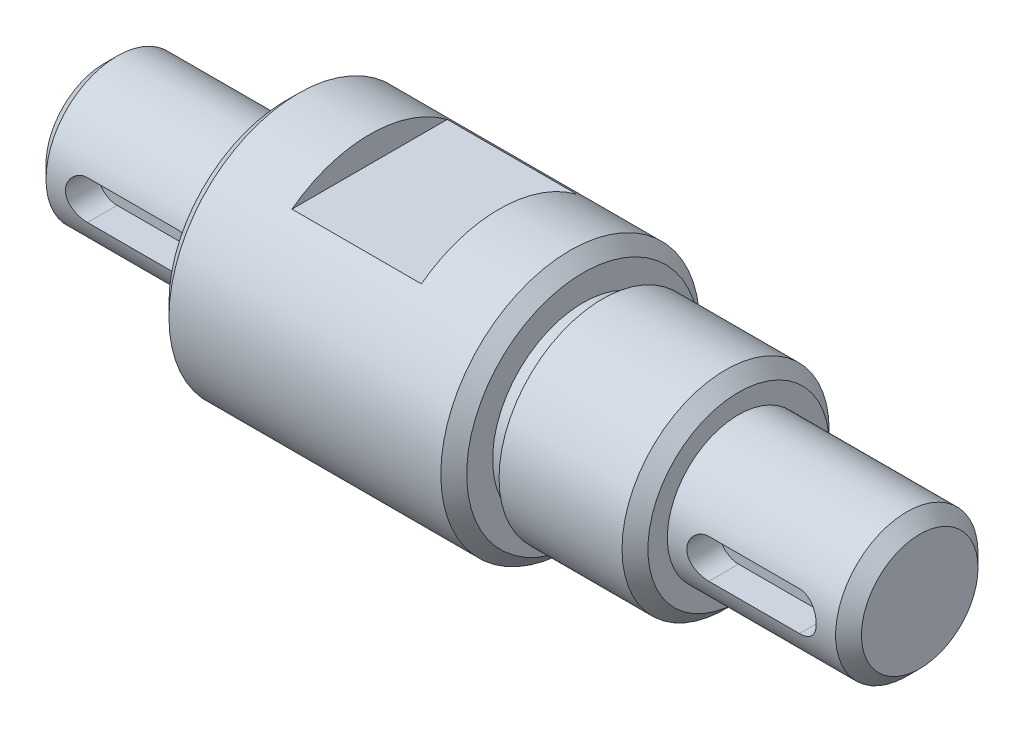
ISO-10303-21;
HEADER;
FILE_DESCRIPTION(('STEP AP214'),'2;1');
FILE_NAME('part.step','',(''),(''),'','','');
FILE_SCHEMA(('AUTOMOTIVE_DESIGN { 1 0 10303 214 1 1 1 1 }'));
ENDSEC;
DATA;
#1=APPLICATION_CONTEXT('core data for automotive mechanical design processes');
#2=APPLICATION_PROTOCOL_DEFINITION('international standard','automotive_design',2000,#1);
#3=PRODUCT_CONTEXT('',#1,'mechanical');
#4=PRODUCT('Part','Part','',(#3));
#5=PRODUCT_RELATED_PRODUCT_CATEGORY('part','',(#4));
#6=PRODUCT_DEFINITION_FORMATION('','',#4);
#7=PRODUCT_DEFINITION_CONTEXT('part definition',#1,'design');
#8=PRODUCT_DEFINITION('design','',#6,#7);
#9=PRODUCT_DEFINITION_SHAPE('','',#8);
#10=(LENGTH_UNIT() NAMED_UNIT(*) SI_UNIT(.MILLI.,.METRE.));
#11=(NAMED_UNIT(*) PLANE_ANGLE_UNIT() SI_UNIT($,.RADIAN.));
#12=(NAMED_UNIT(*) SI_UNIT($,.STERADIAN.) SOLID_ANGLE_UNIT());
#13=UNCERTAINTY_MEASURE_WITH_UNIT(LENGTH_MEASURE(1.E-05),#10,'distance_accuracy_value','');
#14=(GEOMETRIC_REPRESENTATION_CONTEXT(3) GLOBAL_UNCERTAINTY_ASSIGNED_CONTEXT((#13)) GLOBAL_UNIT_ASSIGNED_CONTEXT((#10,
#11,#12)) REPRESENTATION_CONTEXT('',''));
#15=CARTESIAN_POINT('',(0.,0.,0.));
#16=DIRECTION('',(0.,0.,1.));
#17=DIRECTION('',(1.,0.,0.));
#18=AXIS2_PLACEMENT_3D('',#15,#16,#17);
#19=CARTESIAN_POINT('',(126.,0.,0.));
#20=DIRECTION('',(-1.,0.,0.));
#21=DIRECTION('',(0.,0.,1.));
#22=AXIS2_PLACEMENT_3D('',#19,#20,#21);
#23=CYLINDRICAL_SURFACE('',#22,20.);
#24=CARTESIAN_POINT('',(61.,0.,0.));
#25=DIRECTION('',(1.,0.,0.));
#26=DIRECTION('',(0.,0.,-1.));
#27=AXIS2_PLACEMENT_3D('',#24,#25,#26);
#28=CIRCLE('',#27,20.);
#29=CARTESIAN_POINT('',(61.,16.,-12.));
#30=VERTEX_POINT('',#29);
#31=CARTESIAN_POINT('',(61.,16.,12.));
#32=VERTEX_POINT('',#31);
#33=EDGE_CURVE('E233',#30,#32,#28,.T.);
#34=ORIENTED_EDGE('',*,*,#33,.T.);
#35=DIRECTION('',(-1.,0.,0.));
#36=VECTOR('',#35,1.);
#37=CARTESIAN_POINT('',(126.,16.,12.));
#38=LINE('',#37,#36);
#39=CARTESIAN_POINT('',(41.,16.,12.));
#40=VERTEX_POINT('',#39);
#41=EDGE_CURVE('E239',#32,#40,#38,.T.);
#42=ORIENTED_EDGE('',*,*,#41,.T.);
#43=CARTESIAN_POINT('',(41.,0.,0.));
#44=DIRECTION('',(-1.,0.,0.));
#45=DIRECTION('',(0.,0.,1.));
#46=AXIS2_PLACEMENT_3D('',#43,#44,#45);
#47=CIRCLE('',#46,20.);
#48=CARTESIAN_POINT('',(41.,16.,-12.));
#49=VERTEX_POINT('',#48);
#50=EDGE_CURVE('E237',#40,#49,#47,.T.);
#51=ORIENTED_EDGE('',*,*,#50,.T.);
#52=DIRECTION('',(-1.,0.,0.));
#53=VECTOR('',#52,1.);
#54=CARTESIAN_POINT('',(126.,16.,-12.));
#55=LINE('',#54,#53);
#56=EDGE_CURVE('E226',#49,#30,#55,.F.);
#57=ORIENTED_EDGE('',*,*,#56,.T.);
#58=EDGE_LOOP('',(#34,#42,#51,#57));
#59=FACE_BOUND('',#58,.T.);
#60=CARTESIAN_POINT('',(72.,0.,0.));
#61=DIRECTION('',(1.,0.,0.));
#62=DIRECTION('',(0.,0.,-1.));
#63=AXIS2_PLACEMENT_3D('',#60,#61,#62);
#64=CIRCLE('',#63,20.);
#65=CARTESIAN_POINT('',(72.,0.,-20.));
#66=VERTEX_POINT('',#65);
#67=EDGE_CURVE('E217',#66,#66,#64,.F.);
#68=ORIENTED_EDGE('',*,*,#67,.T.);
#69=EDGE_LOOP('',(#68));
#70=FACE_BOUND('',#69,.T.);
#71=CARTESIAN_POINT('',(30.,0.,0.));
#72=DIRECTION('',(-1.,0.,0.));
#73=DIRECTION('',(0.,0.,1.));
#74=AXIS2_PLACEMENT_3D('',#71,#72,#73);
#75=CIRCLE('',#74,20.);
#76=CARTESIAN_POINT('',(30.,0.,20.));
#77=VERTEX_POINT('',#76);
#78=EDGE_CURVE('E214',#77,#77,#75,.F.);
#79=ORIENTED_EDGE('',*,*,#78,.T.);
#80=EDGE_LOOP('',(#79));
#81=FACE_BOUND('',#80,.T.);
#82=ADVANCED_FACE('F47',(#59,#70,#81),#23,.T.);
#83=CARTESIAN_POINT('',(28.,0.,0.));
#84=DIRECTION('',(-1.,0.,0.));
#85=DIRECTION('',(0.,0.,1.));
#86=AXIS2_PLACEMENT_3D('',#83,#84,#85);
#87=PLANE('',#86);
#88=CARTESIAN_POINT('',(28.,0.,0.));
#89=DIRECTION('',(-1.,0.,0.));
#90=DIRECTION('',(0.,0.,1.));
#91=AXIS2_PLACEMENT_3D('',#88,#89,#90);
#92=CIRCLE('',#91,18.);
#93=CARTESIAN_POINT('',(28.,0.,18.));
#94=VERTEX_POINT('',#93);
#95=EDGE_CURVE('E222',#94,#94,#92,.T.);
#96=ORIENTED_EDGE('',*,*,#95,.T.);
#97=EDGE_LOOP('',(#96));
#98=FACE_BOUND('',#97,.T.);
#99=CARTESIAN_POINT('',(28.,0.,0.));
#100=DIRECTION('',(-1.,0.,0.));
#101=DIRECTION('',(0.,0.,1.));
#102=AXIS2_PLACEMENT_3D('',#99,#100,#101);
#103=CIRCLE('',#102,11.);
#104=CARTESIAN_POINT('',(28.,0.,11.));
#105=VERTEX_POINT('',#104);
#106=EDGE_CURVE('E197',#105,#105,#103,.T.);
#107=ORIENTED_EDGE('',*,*,#106,.F.);
#108=EDGE_LOOP('',(#107));
#109=FACE_BOUND('',#108,.T.);
#110=ADVANCED_FACE('F311',(#98,#109),#87,.T.);
#111=CARTESIAN_POINT('',(28.,0.,0.));
#112=DIRECTION('',(-1.,0.,0.));
#113=DIRECTION('',(0.,0.,1.));
#114=AXIS2_PLACEMENT_3D('',#111,#112,#113);
#115=CYLINDRICAL_SURFACE('',#114,11.);
#116=CARTESIAN_POINT('',(22.,-3.,10.5830052442584));
#117=CARTESIAN_POINT('',(22.0826938914098,-3.00000989976809,10.5829949970026));
#118=CARTESIAN_POINT('',(22.165381704592,-2.99658102723595,10.5839742471726));
#119=CARTESIAN_POINT('',(22.3301335662288,-2.98292268314841,10.5878356752194));
#120=CARTESIAN_POINT('',(22.4121977316291,-2.97269452008914,10.5907174869552));
#121=CARTESIAN_POINT('',(22.5749425121448,-2.94554459027321,10.598299618142));
#122=CARTESIAN_POINT('',(22.6556257893863,-2.9286377012691,10.6029958951229));
#123=CARTESIAN_POINT('',(22.8152032540543,-2.88829120712689,10.6140571066224));
#124=CARTESIAN_POINT('',(22.8940974074084,-2.8648514776895,10.6204220728906));
#125=CARTESIAN_POINT('',(23.127242907164,-2.78500332821793,10.6417494872311));
#126=CARTESIAN_POINT('',(23.2781393948553,-2.71903526586307,10.6589535681767));
#127=CARTESIAN_POINT('',(23.5667053417687,-2.56365897700126,10.6973836998985));
#128=CARTESIAN_POINT('',(23.704370097104,-2.47424245636572,10.7186111730805));
#129=CARTESIAN_POINT('',(23.9662097059785,-2.27200424315806,10.7633148792344));
#130=CARTESIAN_POINT('',(24.0899918782437,-2.15868225262837,10.7868322128172));
#131=CARTESIAN_POINT('',(24.3170514389053,-1.91292298422355,10.8331129950831));
#132=CARTESIAN_POINT('',(24.4203254772933,-1.78048258944453,10.8558763200935));
#133=CARTESIAN_POINT('',(24.6050989067465,-1.49749198480952,10.8985459264206));
#134=CARTESIAN_POINT('',(24.686203079821,-1.34667477161624,10.9183977479742));
#135=CARTESIAN_POINT('',(24.8217484137797,-1.03291980522387,10.9525311229674));
#136=CARTESIAN_POINT('',(24.8761955211319,-0.869984764533408,10.9668139185607));
#137=CARTESIAN_POINT('',(24.9556017349027,-0.540744675896731,10.9879090070619));
#138=CARTESIAN_POINT('',(24.9812343263694,-0.374613167612547,10.9948916417093));
#139=CARTESIAN_POINT('',(25.004404664847,-0.0402673813620307,11.0011960589752));
#140=CARTESIAN_POINT('',(25.0019467161783,0.127946573564687,11.0005190152883));
#141=CARTESIAN_POINT('',(24.9694751241847,0.456980924404248,10.9917041066205));
#142=CARTESIAN_POINT('',(24.9401899732267,0.617879308918078,10.9837634920705));
#143=CARTESIAN_POINT('',(24.8560747841412,0.932383527853136,10.9615477415639));
#144=CARTESIAN_POINT('',(24.8012435083153,1.08598900853898,10.9472722986892));
#145=CARTESIAN_POINT('',(24.667045133193,1.38338788045076,10.9137016176963));
#146=CARTESIAN_POINT('',(24.5874317537613,1.52706425574145,10.8943563157114));
#147=CARTESIAN_POINT('',(24.4061201300935,1.79926098198643,10.8527253375081));
#148=CARTESIAN_POINT('',(24.3044178271878,1.92777854091953,10.830439121215));
#149=CARTESIAN_POINT('',(24.0779767649162,2.17034844112028,10.7844948742978));
#150=CARTESIAN_POINT('',(23.952605446131,2.2838069302889,10.760815765188));
#151=CARTESIAN_POINT('',(23.6843376191299,2.48826234185506,10.7153886222241));
#152=CARTESIAN_POINT('',(23.5414362475461,2.57925300980782,10.6936411271564));
#153=CARTESIAN_POINT('',(23.240805187246,2.73667910615421,10.6544469945807));
#154=CARTESIAN_POINT('',(23.0829757572429,2.80293223890785,10.6370325899538));
#155=CARTESIAN_POINT('',(22.7579129054731,2.9076832432578,10.6088816209578));
#156=CARTESIAN_POINT('',(22.590694057725,2.94622291362359,10.598135003286));
#157=CARTESIAN_POINT('',(22.3516455601334,2.98015870664206,10.588613232355));
#158=CARTESIAN_POINT('',(22.2814835402763,2.98759962141261,10.5865140551644));
#159=CARTESIAN_POINT('',(22.1408924467597,2.99751512863222,10.58371035186));
#160=CARTESIAN_POINT('',(22.0704639649415,2.99999749605757,10.5830036423878));
#161=CARTESIAN_POINT('',(22.,3.,10.5830052442584));
#162=B_SPLINE_CURVE_WITH_KNOTS('',3,(#116,#117,#118,#119,#120,#121,#122,#123,#124,#125,#126,
#127,#128,#129,#130,#131,#132,#133,#134,#135,#136,#137,#138,#139,#140,#141,#142,#143,#144,#145,
#146,#147,#148,#149,#150,#151,#152,#153,#154,#155,#156,#157,#158,#159,#160,#161),.UNSPECIFIED.,
.F.,.F.,(4,2,2,2,2,2,2,2,2,2,2,2,2,2,2,2,2,2,2,2,2,2,4),(0.,0.247994395628692,0.49594107954412,
0.743338515979064,0.990740659926203,1.48499724217183,1.97942888795731,2.48547083856628,
2.99159538337128,3.50622794981868,4.02074566333957,4.52296979924471,5.02511698025348,
5.51402000992994,6.00294672920887,6.49689640600088,6.99093691914144,7.50077286033218,
8.01075056671344,8.52441550873707,9.03730408243457,9.24891043373582,9.46018472611218),.UNSPECIFIED.);
#163=CARTESIAN_POINT('',(22.,-3.,10.5830052442584));
#164=VERTEX_POINT('',#163);
#165=CARTESIAN_POINT('',(22.,3.,10.5830052442584));
#166=VERTEX_POINT('',#165);
#167=EDGE_CURVE('E369',#164,#166,#162,.T.);
#168=ORIENTED_EDGE('',*,*,#167,.F.);
#169=DIRECTION('',(-1.,0.,0.));
#170=VECTOR('',#169,1.);
#171=CARTESIAN_POINT('',(28.,-3.,10.5830052442584));
#172=LINE('',#171,#170);
#173=CARTESIAN_POINT('',(8.,-3.,10.5830052442584));
#174=VERTEX_POINT('',#173);
#175=EDGE_CURVE('E12',#174,#164,#172,.F.);
#176=ORIENTED_EDGE('',*,*,#175,.F.);
#177=CARTESIAN_POINT('',(8.,3.,10.5830052442584));
#178=CARTESIAN_POINT('',(7.91730610859018,3.00000989976809,10.5829949970026));
#179=CARTESIAN_POINT('',(7.83461829540797,2.99658102723595,10.5839742471726));
#180=CARTESIAN_POINT('',(7.66986643377117,2.98292268314841,10.5878356752194));
#181=CARTESIAN_POINT('',(7.58780226837093,2.97269452008914,10.5907174869552));
#182=CARTESIAN_POINT('',(7.42505748785523,2.94554459027321,10.598299618142));
#183=CARTESIAN_POINT('',(7.34437421061367,2.9286377012691,10.6029958951229));
#184=CARTESIAN_POINT('',(7.18479674594573,2.88829120712689,10.6140571066224));
#185=CARTESIAN_POINT('',(7.10590259259162,2.8648514776895,10.6204220728906));
#186=CARTESIAN_POINT('',(6.87275709283599,2.78500332821793,10.6417494872311));
#187=CARTESIAN_POINT('',(6.72186060514474,2.71903526586307,10.6589535681767));
#188=CARTESIAN_POINT('',(6.43329465823131,2.56365897700125,10.6973836998985));
#189=CARTESIAN_POINT('',(6.29562990289596,2.47424245636572,10.7186111730805));
#190=CARTESIAN_POINT('',(6.0337902940215,2.27200424315806,10.7633148792344));
#191=CARTESIAN_POINT('',(5.91000812175632,2.15868225262836,10.7868322128172));
#192=CARTESIAN_POINT('',(5.68294856109473,1.91292298422355,10.8331129950831));
#193=CARTESIAN_POINT('',(5.57967452270675,1.78048258944452,10.8558763200935));
#194=CARTESIAN_POINT('',(5.39490109325355,1.49749198480952,10.8985459264206));
#195=CARTESIAN_POINT('',(5.31379692017903,1.34667477161623,10.9183977479742));
#196=CARTESIAN_POINT('',(5.17825158622032,1.03291980522387,10.9525311229674));
#197=CARTESIAN_POINT('',(5.12380447886811,0.869984764533405,10.9668139185607));
#198=CARTESIAN_POINT('',(5.0443982650973,0.540744675896728,10.9879090070619));
#199=CARTESIAN_POINT('',(5.01876567363063,0.374613167612543,10.9948916417093));
#200=CARTESIAN_POINT('',(4.99559533515301,0.0402673813620265,11.0011960589752));
#201=CARTESIAN_POINT('',(4.99805328382166,-0.127946573564691,11.0005190152883));
#202=CARTESIAN_POINT('',(5.03052487581529,-0.456980924404252,10.9917041066205));
#203=CARTESIAN_POINT('',(5.05981002677334,-0.617879308918082,10.9837634920705));
#204=CARTESIAN_POINT('',(5.14392521585875,-0.932383527853141,10.9615477415639));
#205=CARTESIAN_POINT('',(5.19875649168473,-1.08598900853898,10.9472722986892));
#206=CARTESIAN_POINT('',(5.33295486680702,-1.38338788045077,10.9137016176963));
#207=CARTESIAN_POINT('',(5.41256824623875,-1.52706425574145,10.8943563157114));
#208=CARTESIAN_POINT('',(5.59387986990652,-1.79926098198643,10.8527253375081));
#209=CARTESIAN_POINT('',(5.69558217281222,-1.92777854091953,10.830439121215));
#210=CARTESIAN_POINT('',(5.92202323508377,-2.17034844112028,10.7844948742978));
#211=CARTESIAN_POINT('',(6.04739455386901,-2.2838069302889,10.760815765188));
#212=CARTESIAN_POINT('',(6.31566238087013,-2.48826234185506,10.7153886222241));
#213=CARTESIAN_POINT('',(6.45856375245395,-2.57925300980782,10.6936411271564));
#214=CARTESIAN_POINT('',(6.75919481275404,-2.73667910615422,10.6544469945807));
#215=CARTESIAN_POINT('',(6.91702424275707,-2.80293223890785,10.6370325899538));
#216=CARTESIAN_POINT('',(7.24208709452695,-2.9076832432578,10.6088816209578));
#217=CARTESIAN_POINT('',(7.40930594227505,-2.94622291362359,10.598135003286));
#218=CARTESIAN_POINT('',(7.64835443986661,-2.98015870664206,10.588613232355));
#219=CARTESIAN_POINT('',(7.71851645972366,-2.98759962141261,10.5865140551644));
#220=CARTESIAN_POINT('',(7.85910755324026,-2.99751512863222,10.58371035186));
#221=CARTESIAN_POINT('',(7.92953603505847,-2.99999749605757,10.5830036423878));
#222=CARTESIAN_POINT('',(8.,-3.,10.5830052442584));
#223=B_SPLINE_CURVE_WITH_KNOTS('',3,(#177,#178,#179,#180,#181,#182,#183,#184,#185,#186,#187,
#188,#189,#190,#191,#192,#193,#194,#195,#196,#197,#198,#199,#200,#201,#202,#203,#204,#205,#206,
#207,#208,#209,#210,#211,#212,#213,#214,#215,#216,#217,#218,#219,#220,#221,#222),.UNSPECIFIED.,
.F.,.F.,(4,2,2,2,2,2,2,2,2,2,2,2,2,2,2,2,2,2,2,2,2,2,4),(0.,0.247994395628696,0.495941079544124,
0.743338515979067,0.990740659926207,1.48499724217183,1.97942888795731,2.48547083856629,
2.99159538337129,3.50622794981869,4.02074566333957,4.52296979924472,5.02511698025349,
5.51402000992994,6.00294672920888,6.49689640600088,6.99093691914145,7.50077286033219,
8.01075056671345,8.52441550873707,9.03730408243458,9.24891043373582,9.46018472611218),.UNSPECIFIED.);
#224=CARTESIAN_POINT('',(8.,3.,10.5830052442584));
#225=VERTEX_POINT('',#224);
#226=EDGE_CURVE('E59',#225,#174,#223,.T.);
#227=ORIENTED_EDGE('',*,*,#226,.F.);
#228=DIRECTION('',(-1.,0.,0.));
#229=VECTOR('',#228,1.);
#230=CARTESIAN_POINT('',(28.,3.,10.5830052442584));
#231=LINE('',#230,#229);
#232=EDGE_CURVE('E385',#166,#225,#231,.T.);
#233=ORIENTED_EDGE('',*,*,#232,.F.);
#234=EDGE_LOOP('',(#168,#176,#227,#233));
#235=FACE_BOUND('',#234,.T.);
#236=CARTESIAN_POINT('',(2.00000000000003,0.,0.));
#237=DIRECTION('',(1.,0.,0.));
#238=DIRECTION('',(0.,0.,-1.));
#239=AXIS2_PLACEMENT_3D('',#236,#237,#238);
#240=CIRCLE('',#239,11.);
#241=CARTESIAN_POINT('',(2.00000000000003,0.,-11.));
#242=VERTEX_POINT('',#241);
#243=EDGE_CURVE('E229',#242,#242,#240,.T.);
#244=ORIENTED_EDGE('',*,*,#243,.T.);
#245=EDGE_LOOP('',(#244));
#246=FACE_BOUND('',#245,.T.);
#247=ORIENTED_EDGE('',*,*,#106,.T.);
#248=EDGE_LOOP('',(#247));
#249=FACE_BOUND('',#248,.T.);
#250=ADVANCED_FACE('F319',(#235,#246,#249),#115,.T.);
#251=CARTESIAN_POINT('',(0.,0.,0.));
#252=DIRECTION('',(1.,0.,0.));
#253=DIRECTION('',(0.,0.,-1.));
#254=AXIS2_PLACEMENT_3D('',#251,#252,#253);
#255=PLANE('',#254);
#256=CARTESIAN_POINT('',(0.,0.,0.));
#257=DIRECTION('',(1.,0.,0.));
#258=DIRECTION('',(0.,0.,-1.));
#259=AXIS2_PLACEMENT_3D('',#256,#257,#258);
#260=CIRCLE('',#259,8.99999999999999);
#261=CARTESIAN_POINT('',(0.,0.,-8.99999999999999));
#262=VERTEX_POINT('',#261);
#263=EDGE_CURVE('E221',#262,#262,#260,.F.);
#264=ORIENTED_EDGE('',*,*,#263,.T.);
#265=EDGE_LOOP('',(#264));
#266=FACE_BOUND('',#265,.T.);
#267=ADVANCED_FACE('F294',(#266),#255,.F.);
#268=CARTESIAN_POINT('',(74.,0.,0.));
#269=DIRECTION('',(1.,0.,0.));
#270=DIRECTION('',(0.,0.,-1.));
#271=AXIS2_PLACEMENT_3D('',#268,#269,#270);
#272=PLANE('',#271);
#273=CARTESIAN_POINT('',(74.,0.,0.));
#274=DIRECTION('',(1.,0.,0.));
#275=DIRECTION('',(0.,0.,-1.));
#276=AXIS2_PLACEMENT_3D('',#273,#274,#275);
#277=CIRCLE('',#276,18.);
#278=CARTESIAN_POINT('',(74.,0.,-18.));
#279=VERTEX_POINT('',#278);
#280=EDGE_CURVE('E215',#279,#279,#277,.T.);
#281=ORIENTED_EDGE('',*,*,#280,.T.);
#282=EDGE_LOOP('',(#281));
#283=FACE_BOUND('',#282,.T.);
#284=CARTESIAN_POINT('',(74.,0.,0.));
#285=DIRECTION('',(1.,0.,0.));
#286=DIRECTION('',(0.,0.,-1.));
#287=AXIS2_PLACEMENT_3D('',#284,#285,#286);
#288=CIRCLE('',#287,14.);
#289=CARTESIAN_POINT('',(74.,0.,-14.));
#290=VERTEX_POINT('',#289);
#291=EDGE_CURVE('E188',#290,#290,#288,.T.);
#292=ORIENTED_EDGE('',*,*,#291,.F.);
#293=EDGE_LOOP('',(#292));
#294=FACE_BOUND('',#293,.T.);
#295=ADVANCED_FACE('F292',(#283,#294),#272,.T.);
#296=CARTESIAN_POINT('',(77.,0.,0.));
#297=DIRECTION('',(1.,0.,0.));
#298=DIRECTION('',(0.,0.,-1.));
#299=AXIS2_PLACEMENT_3D('',#296,#297,#298);
#300=PLANE('',#299);
#301=CARTESIAN_POINT('',(77.,0.,0.));
#302=DIRECTION('',(1.,0.,0.));
#303=DIRECTION('',(0.,0.,-1.));
#304=AXIS2_PLACEMENT_3D('',#301,#302,#303);
#305=CIRCLE('',#304,16.);
#306=CARTESIAN_POINT('',(77.,0.,-16.));
#307=VERTEX_POINT('',#306);
#308=EDGE_CURVE('E190',#307,#307,#305,.F.);
#309=ORIENTED_EDGE('',*,*,#308,.T.);
#310=EDGE_LOOP('',(#309));
#311=FACE_BOUND('',#310,.T.);
#312=CARTESIAN_POINT('',(77.,0.,0.));
#313=DIRECTION('',(1.,0.,0.));
#314=DIRECTION('',(0.,0.,-1.));
#315=AXIS2_PLACEMENT_3D('',#312,#313,#314);
#316=CIRCLE('',#315,14.);
#317=CARTESIAN_POINT('',(77.,0.,-14.));
#318=VERTEX_POINT('',#317);
#319=EDGE_CURVE('E181',#318,#318,#316,.T.);
#320=ORIENTED_EDGE('',*,*,#319,.T.);
#321=EDGE_LOOP('',(#320));
#322=FACE_BOUND('',#321,.T.);
#323=ADVANCED_FACE('F289',(#311,#322),#300,.F.);
#324=CARTESIAN_POINT('',(74.,0.,0.));
#325=DIRECTION('',(1.,0.,0.));
#326=DIRECTION('',(0.,0.,-1.));
#327=AXIS2_PLACEMENT_3D('',#324,#325,#326);
#328=CYLINDRICAL_SURFACE('',#327,14.);
#329=ORIENTED_EDGE('',*,*,#291,.T.);
#330=EDGE_LOOP('',(#329));
#331=FACE_BOUND('',#330,.T.);
#332=ORIENTED_EDGE('',*,*,#319,.F.);
#333=EDGE_LOOP('',(#332));
#334=FACE_BOUND('',#333,.T.);
#335=ADVANCED_FACE('F281',(#331,#334),#328,.T.);
#336=CARTESIAN_POINT('',(126.,0.,0.));
#337=DIRECTION('',(1.,0.,0.));
#338=DIRECTION('',(0.,0.,-1.));
#339=AXIS2_PLACEMENT_3D('',#336,#337,#338);
#340=PLANE('',#339);
#341=CARTESIAN_POINT('',(126.,0.,0.));
#342=DIRECTION('',(1.,0.,0.));
#343=DIRECTION('',(0.,0.,-1.));
#344=AXIS2_PLACEMENT_3D('',#341,#342,#343);
#345=CIRCLE('',#344,8.99999999999999);
#346=CARTESIAN_POINT('',(126.,0.,-8.99999999999999));
#347=VERTEX_POINT('',#346);
#348=EDGE_CURVE('E199',#347,#347,#345,.T.);
#349=ORIENTED_EDGE('',*,*,#348,.T.);
#350=EDGE_LOOP('',(#349));
#351=FACE_BOUND('',#350,.T.);
#352=ADVANCED_FACE('F288',(#351),#340,.T.);
#353=CARTESIAN_POINT('',(98.,0.,0.));
#354=DIRECTION('',(1.,0.,0.));
#355=DIRECTION('',(0.,0.,-1.));
#356=AXIS2_PLACEMENT_3D('',#353,#354,#355);
#357=CYLINDRICAL_SURFACE('',#356,11.);
#358=CARTESIAN_POINT('',(118.,-3.,10.5830052442584));
#359=CARTESIAN_POINT('',(118.08269389141,-3.00000989976809,10.5829949970026));
#360=CARTESIAN_POINT('',(118.165381704592,-2.99658102723595,10.5839742471726));
#361=CARTESIAN_POINT('',(118.330133566229,-2.98292268314841,10.5878356752194));
#362=CARTESIAN_POINT('',(118.412197731629,-2.97269452008914,10.5907174869552));
#363=CARTESIAN_POINT('',(118.574942512145,-2.94554459027321,10.598299618142));
#364=CARTESIAN_POINT('',(118.655625789386,-2.9286377012691,10.6029958951229));
#365=CARTESIAN_POINT('',(118.815203254054,-2.88829120712689,10.6140571066224));
#366=CARTESIAN_POINT('',(118.894097407408,-2.8648514776895,10.6204220728906));
#367=CARTESIAN_POINT('',(119.127242907164,-2.78500332821793,10.6417494872311));
#368=CARTESIAN_POINT('',(119.278139394855,-2.71903526586307,10.6589535681767));
#369=CARTESIAN_POINT('',(119.566705341769,-2.56365897700126,10.6973836998985));
#370=CARTESIAN_POINT('',(119.704370097104,-2.47424245636572,10.7186111730805));
#371=CARTESIAN_POINT('',(119.966209705978,-2.27200424315806,10.7633148792344));
#372=CARTESIAN_POINT('',(120.089991878244,-2.15868225262836,10.7868322128172));
#373=CARTESIAN_POINT('',(120.317051438905,-1.91292298422355,10.8331129950831));
#374=CARTESIAN_POINT('',(120.420325477293,-1.78048258944453,10.8558763200935));
#375=CARTESIAN_POINT('',(120.605098906746,-1.49749198480952,10.8985459264206));
#376=CARTESIAN_POINT('',(120.686203079821,-1.34667477161624,10.9183977479742));
#377=CARTESIAN_POINT('',(120.82174841378,-1.03291980522387,10.9525311229674));
#378=CARTESIAN_POINT('',(120.876195521132,-0.869984764533407,10.9668139185607));
#379=CARTESIAN_POINT('',(120.955601734903,-0.540744675896728,10.9879090070619));
#380=CARTESIAN_POINT('',(120.981234326369,-0.374613167612542,10.9948916417093));
#381=CARTESIAN_POINT('',(121.004404664847,-0.0402673813620226,11.0011960589752));
#382=CARTESIAN_POINT('',(121.001946716178,0.127946573564695,11.0005190152883));
#383=CARTESIAN_POINT('',(120.969475124185,0.456980924404257,10.9917041066205));
#384=CARTESIAN_POINT('',(120.940189973227,0.617879308918086,10.9837634920705));
#385=CARTESIAN_POINT('',(120.856074784141,0.932383527853143,10.9615477415639));
#386=CARTESIAN_POINT('',(120.801243508315,1.08598900853898,10.9472722986892));
#387=CARTESIAN_POINT('',(120.667045133193,1.38338788045077,10.9137016176963));
#388=CARTESIAN_POINT('',(120.587431753761,1.52706425574144,10.8943563157114));
#389=CARTESIAN_POINT('',(120.406120130093,1.79926098198643,10.8527253375081));
#390=CARTESIAN_POINT('',(120.304417827188,1.92777854091953,10.830439121215));
#391=CARTESIAN_POINT('',(120.077976764916,2.17034844112028,10.7844948742978));
#392=CARTESIAN_POINT('',(119.952605446131,2.28380693028889,10.760815765188));
#393=CARTESIAN_POINT('',(119.68433761913,2.48826234185506,10.7153886222241));
#394=CARTESIAN_POINT('',(119.541436247546,2.57925300980782,10.6936411271564));
#395=CARTESIAN_POINT('',(119.240805187246,2.73667910615422,10.6544469945807));
#396=CARTESIAN_POINT('',(119.082975757243,2.80293223890785,10.6370325899538));
#397=CARTESIAN_POINT('',(118.757912905473,2.9076832432578,10.6088816209578));
#398=CARTESIAN_POINT('',(118.590694057725,2.94622291362359,10.598135003286));
#399=CARTESIAN_POINT('',(118.351645560133,2.98015870664206,10.588613232355));
#400=CARTESIAN_POINT('',(118.281483540276,2.98759962141261,10.5865140551644));
#401=CARTESIAN_POINT('',(118.14089244676,2.99751512863222,10.58371035186));
#402=CARTESIAN_POINT('',(118.070463964942,2.99999749605757,10.5830036423878));
#403=CARTESIAN_POINT('',(118.,3.,10.5830052442584));
#404=B_SPLINE_CURVE_WITH_KNOTS('',3,(#358,#359,#360,#361,#362,#363,#364,#365,#366,#367,#368,
#369,#370,#371,#372,#373,#374,#375,#376,#377,#378,#379,#380,#381,#382,#383,#384,#385,#386,#387,
#388,#389,#390,#391,#392,#393,#394,#395,#396,#397,#398,#399,#400,#401,#402,#403),.UNSPECIFIED.,
.F.,.F.,(4,2,2,2,2,2,2,2,2,2,2,2,2,2,2,2,2,2,2,2,2,2,4),(0.,0.247994395628699,0.495941079544131,
0.743338515979078,0.99074065992621,1.48499724217182,1.97942888795732,2.48547083856629,
2.99159538337129,3.50622794981869,4.02074566333957,4.52296979924472,5.02511698025349,
5.51402000992995,6.00294672920888,6.49689640600088,6.99093691914144,7.50077286033218,
8.01075056671345,8.52441550873707,9.03730408243458,9.24891043373583,9.46018472611218),.UNSPECIFIED.);
#405=CARTESIAN_POINT('',(118.,-3.,10.5830052442584));
#406=VERTEX_POINT('',#405);
#407=CARTESIAN_POINT('',(118.,3.,10.5830052442584));
#408=VERTEX_POINT('',#407);
#409=EDGE_CURVE('E244',#406,#408,#404,.T.);
#410=ORIENTED_EDGE('',*,*,#409,.F.);
#411=DIRECTION('',(1.,0.,0.));
#412=VECTOR('',#411,1.);
#413=CARTESIAN_POINT('',(98.,-3.,10.5830052442584));
#414=LINE('',#413,#412);
#415=CARTESIAN_POINT('',(104.,-3.,10.5830052442584));
#416=VERTEX_POINT('',#415);
#417=EDGE_CURVE('E391',#416,#406,#414,.T.);
#418=ORIENTED_EDGE('',*,*,#417,.F.);
#419=CARTESIAN_POINT('',(104.,3.,10.5830052442584));
#420=CARTESIAN_POINT('',(103.91730610859,3.00000989976809,10.5829949970026));
#421=CARTESIAN_POINT('',(103.834618295408,2.99658102723595,10.5839742471726));
#422=CARTESIAN_POINT('',(103.669866433771,2.98292268314841,10.5878356752194));
#423=CARTESIAN_POINT('',(103.587802268371,2.97269452008914,10.5907174869552));
#424=CARTESIAN_POINT('',(103.425057487855,2.94554459027321,10.598299618142));
#425=CARTESIAN_POINT('',(103.344374210614,2.9286377012691,10.6029958951229));
#426=CARTESIAN_POINT('',(103.184796745946,2.88829120712689,10.6140571066224));
#427=CARTESIAN_POINT('',(103.105902592592,2.8648514776895,10.6204220728906));
#428=CARTESIAN_POINT('',(102.872757092836,2.78500332821793,10.6417494872311));
#429=CARTESIAN_POINT('',(102.721860605145,2.71903526586307,10.6589535681767));
#430=CARTESIAN_POINT('',(102.433294658231,2.56365897700126,10.6973836998985));
#431=CARTESIAN_POINT('',(102.295629902896,2.47424245636572,10.7186111730805));
#432=CARTESIAN_POINT('',(102.033790294022,2.27200424315806,10.7633148792344));
#433=CARTESIAN_POINT('',(101.910008121756,2.15868225262836,10.7868322128172));
#434=CARTESIAN_POINT('',(101.682948561095,1.91292298422355,10.8331129950831));
#435=CARTESIAN_POINT('',(101.579674522707,1.78048258944453,10.8558763200935));
#436=CARTESIAN_POINT('',(101.394901093254,1.49749198480952,10.8985459264206));
#437=CARTESIAN_POINT('',(101.313796920179,1.34667477161624,10.9183977479742));
#438=CARTESIAN_POINT('',(101.17825158622,1.03291980522387,10.9525311229674));
#439=CARTESIAN_POINT('',(101.123804478868,0.869984764533407,10.9668139185607));
#440=CARTESIAN_POINT('',(101.044398265097,0.540744675896728,10.9879090070619));
#441=CARTESIAN_POINT('',(101.018765673631,0.374613167612542,10.9948916417093));
#442=CARTESIAN_POINT('',(100.995595335153,0.0402673813620226,11.0011960589752));
#443=CARTESIAN_POINT('',(100.998053283822,-0.127946573564695,11.0005190152883));
#444=CARTESIAN_POINT('',(101.030524875815,-0.456980924404257,10.9917041066205));
#445=CARTESIAN_POINT('',(101.059810026773,-0.617879308918086,10.9837634920705));
#446=CARTESIAN_POINT('',(101.143925215859,-0.932383527853143,10.9615477415639));
#447=CARTESIAN_POINT('',(101.198756491685,-1.08598900853898,10.9472722986892));
#448=CARTESIAN_POINT('',(101.332954866807,-1.38338788045077,10.9137016176963));
#449=CARTESIAN_POINT('',(101.412568246239,-1.52706425574145,10.8943563157114));
#450=CARTESIAN_POINT('',(101.593879869907,-1.79926098198643,10.8527253375081));
#451=CARTESIAN_POINT('',(101.695582172812,-1.92777854091953,10.830439121215));
#452=CARTESIAN_POINT('',(101.922023235084,-2.17034844112028,10.7844948742978));
#453=CARTESIAN_POINT('',(102.047394553869,-2.2838069302889,10.760815765188));
#454=CARTESIAN_POINT('',(102.31566238087,-2.48826234185506,10.7153886222241));
#455=CARTESIAN_POINT('',(102.458563752454,-2.57925300980782,10.6936411271564));
#456=CARTESIAN_POINT('',(102.759194812754,-2.73667910615422,10.6544469945807));
#457=CARTESIAN_POINT('',(102.917024242757,-2.80293223890785,10.6370325899538));
#458=CARTESIAN_POINT('',(103.242087094527,-2.9076832432578,10.6088816209578));
#459=CARTESIAN_POINT('',(103.409305942275,-2.94622291362359,10.598135003286));
#460=CARTESIAN_POINT('',(103.648354439867,-2.98015870664206,10.588613232355));
#461=CARTESIAN_POINT('',(103.718516459724,-2.98759962141261,10.5865140551644));
#462=CARTESIAN_POINT('',(103.85910755324,-2.99751512863222,10.58371035186));
#463=CARTESIAN_POINT('',(103.929536035058,-2.99999749605757,10.5830036423878));
#464=CARTESIAN_POINT('',(104.,-3.,10.5830052442584));
#465=B_SPLINE_CURVE_WITH_KNOTS('',3,(#419,#420,#421,#422,#423,#424,#425,#426,#427,#428,#429,
#430,#431,#432,#433,#434,#435,#436,#437,#438,#439,#440,#441,#442,#443,#444,#445,#446,#447,#448,
#449,#450,#451,#452,#453,#454,#455,#456,#457,#458,#459,#460,#461,#462,#463,#464),.UNSPECIFIED.,
.F.,.F.,(4,2,2,2,2,2,2,2,2,2,2,2,2,2,2,2,2,2,2,2,2,2,4),(0.,0.247994395628713,0.495941079544131,
0.743338515979078,0.99074065992621,1.48499724217182,1.97942888795731,2.48547083856629,
2.99159538337129,3.50622794981869,4.02074566333957,4.52296979924472,5.02511698025349,
5.51402000992995,6.00294672920888,6.49689640600088,6.99093691914144,7.50077286033219,
8.01075056671345,8.52441550873708,9.03730408243458,9.24891043373584,9.46018472611219),.UNSPECIFIED.);
#466=CARTESIAN_POINT('',(104.,3.,10.5830052442584));
#467=VERTEX_POINT('',#466);
#468=EDGE_CURVE('E388',#467,#416,#465,.T.);
#469=ORIENTED_EDGE('',*,*,#468,.F.);
#470=DIRECTION('',(1.,0.,0.));
#471=VECTOR('',#470,1.);
#472=CARTESIAN_POINT('',(98.,3.,10.5830052442584));
#473=LINE('',#472,#471);
#474=EDGE_CURVE('E246',#408,#467,#473,.F.);
#475=ORIENTED_EDGE('',*,*,#474,.F.);
#476=EDGE_LOOP('',(#410,#418,#469,#475));
#477=FACE_BOUND('',#476,.T.);
#478=CARTESIAN_POINT('',(124.,0.,0.));
#479=DIRECTION('',(1.,0.,0.));
#480=DIRECTION('',(0.,0.,-1.));
#481=AXIS2_PLACEMENT_3D('',#478,#479,#480);
#482=CIRCLE('',#481,11.);
#483=CARTESIAN_POINT('',(124.,0.,-11.));
#484=VERTEX_POINT('',#483);
#485=EDGE_CURVE('E201',#484,#484,#482,.F.);
#486=ORIENTED_EDGE('',*,*,#485,.T.);
#487=EDGE_LOOP('',(#486));
#488=FACE_BOUND('',#487,.T.);
#489=CARTESIAN_POINT('',(98.,0.,0.));
#490=DIRECTION('',(1.,0.,0.));
#491=DIRECTION('',(0.,0.,-1.));
#492=AXIS2_PLACEMENT_3D('',#489,#490,#491);
#493=CIRCLE('',#492,11.);
#494=CARTESIAN_POINT('',(98.,0.,-11.));
#495=VERTEX_POINT('',#494);
#496=EDGE_CURVE('E194',#495,#495,#493,.T.);
#497=ORIENTED_EDGE('',*,*,#496,.T.);
#498=EDGE_LOOP('',(#497));
#499=FACE_BOUND('',#498,.T.);
#500=ADVANCED_FACE('F252',(#477,#488,#499),#357,.T.);
#501=CARTESIAN_POINT('',(98.,0.,0.));
#502=DIRECTION('',(1.,0.,0.));
#503=DIRECTION('',(0.,0.,-1.));
#504=AXIS2_PLACEMENT_3D('',#501,#502,#503);
#505=PLANE('',#504);
#506=CARTESIAN_POINT('',(98.,0.,0.));
#507=DIRECTION('',(1.,0.,0.));
#508=DIRECTION('',(0.,0.,-1.));
#509=AXIS2_PLACEMENT_3D('',#506,#507,#508);
#510=CIRCLE('',#509,14.0000000000001);
#511=CARTESIAN_POINT('',(98.,0.,-14.0000000000001));
#512=VERTEX_POINT('',#511);
#513=EDGE_CURVE('E206',#512,#512,#510,.T.);
#514=ORIENTED_EDGE('',*,*,#513,.T.);
#515=EDGE_LOOP('',(#514));
#516=FACE_BOUND('',#515,.T.);
#517=ORIENTED_EDGE('',*,*,#496,.F.);
#518=EDGE_LOOP('',(#517));
#519=FACE_BOUND('',#518,.T.);
#520=ADVANCED_FACE('F302',(#516,#519),#505,.T.);
#521=CARTESIAN_POINT('',(77.,0.,0.));
#522=DIRECTION('',(1.,0.,0.));
#523=DIRECTION('',(0.,0.,-1.));
#524=AXIS2_PLACEMENT_3D('',#521,#522,#523);
#525=CYLINDRICAL_SURFACE('',#524,16.);
#526=CARTESIAN_POINT('',(96.,0.,0.));
#527=DIRECTION('',(1.,0.,0.));
#528=DIRECTION('',(0.,0.,-1.));
#529=AXIS2_PLACEMENT_3D('',#526,#527,#528);
#530=CIRCLE('',#529,16.);
#531=CARTESIAN_POINT('',(96.,0.,-16.));
#532=VERTEX_POINT('',#531);
#533=EDGE_CURVE('E207',#532,#532,#530,.F.);
#534=CARTESIAN_POINT('',(96.,0.,-16.));
#535=CARTESIAN_POINT('',(95.8020833333334,0.,-16.));
#536=CARTESIAN_POINT('',(95.6041666666667,0.,-16.));
#537=CARTESIAN_POINT('',(95.2083333333334,0.,-16.));
#538=CARTESIAN_POINT('',(95.0104166666667,0.,-16.));
#539=CARTESIAN_POINT('',(94.6145833333334,0.,-16.));
#540=CARTESIAN_POINT('',(94.4166666666667,0.,-16.));
#541=CARTESIAN_POINT('',(94.0208333333334,0.,-16.));
#542=CARTESIAN_POINT('',(93.8229166666667,0.,-16.));
#543=CARTESIAN_POINT('',(93.4270833333334,0.,-16.));
#544=CARTESIAN_POINT('',(93.2291666666667,0.,-16.));
#545=CARTESIAN_POINT('',(92.8333333333334,0.,-16.));
#546=CARTESIAN_POINT('',(92.6354166666667,0.,-16.));
#547=CARTESIAN_POINT('',(92.2395833333334,0.,-16.));
#548=CARTESIAN_POINT('',(92.0416666666667,0.,-16.));
#549=CARTESIAN_POINT('',(91.6458333333334,0.,-16.));
#550=CARTESIAN_POINT('',(91.4479166666667,0.,-16.));
#551=CARTESIAN_POINT('',(91.0520833333334,0.,-16.));
#552=CARTESIAN_POINT('',(90.8541666666667,0.,-16.));
#553=CARTESIAN_POINT('',(90.4583333333334,0.,-16.));
#554=CARTESIAN_POINT('',(90.2604166666667,0.,-16.));
#555=CARTESIAN_POINT('',(89.8645833333334,0.,-16.));
#556=CARTESIAN_POINT('',(89.6666666666667,0.,-16.));
#557=CARTESIAN_POINT('',(89.2708333333334,0.,-16.));
#558=CARTESIAN_POINT('',(89.0729166666667,0.,-16.));
#559=CARTESIAN_POINT('',(88.6770833333334,0.,-16.));
#560=CARTESIAN_POINT('',(88.4791666666667,0.,-16.));
#561=CARTESIAN_POINT('',(88.0833333333333,0.,-16.));
#562=CARTESIAN_POINT('',(87.8854166666667,0.,-16.));
#563=CARTESIAN_POINT('',(87.4895833333334,0.,-16.));
#564=CARTESIAN_POINT('',(87.2916666666667,0.,-16.));
#565=CARTESIAN_POINT('',(86.8958333333334,0.,-16.));
#566=CARTESIAN_POINT('',(86.6979166666667,0.,-16.));
#567=CARTESIAN_POINT('',(86.3020833333333,0.,-16.));
#568=CARTESIAN_POINT('',(86.1041666666667,0.,-16.));
#569=CARTESIAN_POINT('',(85.7083333333333,0.,-16.));
#570=CARTESIAN_POINT('',(85.5104166666667,0.,-16.));
#571=CARTESIAN_POINT('',(85.1145833333333,0.,-16.));
#572=CARTESIAN_POINT('',(84.9166666666667,0.,-16.));
#573=CARTESIAN_POINT('',(84.5208333333333,0.,-16.));
#574=CARTESIAN_POINT('',(84.3229166666667,0.,-16.));
#575=CARTESIAN_POINT('',(83.9270833333333,0.,-16.));
#576=CARTESIAN_POINT('',(83.7291666666667,0.,-16.));
#577=CARTESIAN_POINT('',(83.3333333333333,0.,-16.));
#578=CARTESIAN_POINT('',(83.1354166666667,0.,-16.));
#579=CARTESIAN_POINT('',(82.7395833333333,0.,-16.));
#580=CARTESIAN_POINT('',(82.5416666666667,0.,-16.));
#581=CARTESIAN_POINT('',(82.1458333333333,0.,-16.));
#582=CARTESIAN_POINT('',(81.9479166666667,0.,-16.));
#583=CARTESIAN_POINT('',(81.5520833333333,0.,-16.));
#584=CARTESIAN_POINT('',(81.3541666666667,0.,-16.));
#585=CARTESIAN_POINT('',(80.9583333333333,0.,-16.));
#586=CARTESIAN_POINT('',(80.7604166666667,0.,-16.));
#587=CARTESIAN_POINT('',(80.3645833333333,0.,-16.));
#588=CARTESIAN_POINT('',(80.1666666666667,0.,-16.));
#589=CARTESIAN_POINT('',(79.7708333333333,0.,-16.));
#590=CARTESIAN_POINT('',(79.5729166666667,0.,-16.));
#591=CARTESIAN_POINT('',(79.1770833333333,0.,-16.));
#592=CARTESIAN_POINT('',(78.9791666666667,0.,-16.));
#593=CARTESIAN_POINT('',(78.5833333333333,0.,-16.));
#594=CARTESIAN_POINT('',(78.3854166666667,0.,-16.));
#595=CARTESIAN_POINT('',(77.9895833333333,0.,-16.));
#596=CARTESIAN_POINT('',(77.7916666666667,0.,-16.));
#597=CARTESIAN_POINT('',(77.3958333333333,0.,-16.));
#598=CARTESIAN_POINT('',(77.1979166666667,0.,-16.));
#599=CARTESIAN_POINT('',(77.,0.,-16.));
#600=B_SPLINE_CURVE_WITH_KNOTS('',3,(#534,#535,#536,#537,#538,#539,#540,#541,#542,#543,#544,
#545,#546,#547,#548,#549,#550,#551,#552,#553,#554,#555,#556,#557,#558,#559,#560,#561,#562,#563,
#564,#565,#566,#567,#568,#569,#570,#571,#572,#573,#574,#575,#576,#577,#578,#579,#580,#581,#582,
#583,#584,#585,#586,#587,#588,#589,#590,#591,#592,#593,#594,#595,#596,#597,#598,#599),
.UNSPECIFIED.,.F.,.F.,(4,2,2,2,2,2,2,2,2,2,2,2,2,2,2,2,2,2,2,2,2,2,2,2,2,2,2,2,2,2,2,2,4),(0.,
0.593750000000004,1.18750000000001,1.78125000000001,2.375,2.96875000000001,3.56250000000001,
4.15625000000001,4.75000000000002,5.34375000000002,5.93750000000001,6.53125000000002,
7.12500000000002,7.71875000000002,8.31250000000003,8.90625000000002,9.50000000000002,10.09375,
10.6875,11.28125,11.875,12.46875,13.0625,13.65625,14.25,14.84375,15.4375,16.03125,16.625,
17.21875,17.8125,18.4062500000001,19.),.UNSPECIFIED.);
#601=EDGE_CURVE('BSEAM297',#532,#307,#600,.T.);
#602=ORIENTED_EDGE('',*,*,#533,.T.);
#603=ORIENTED_EDGE('',*,*,#308,.F.);
#604=ORIENTED_EDGE('',*,*,#601,.T.);
#605=ORIENTED_EDGE('',*,*,#601,.F.);
#606=EDGE_LOOP('',(#602,#604,#603,#605));
#607=FACE_BOUND('',#606,.T.);
#608=ADVANCED_FACE('F297',(#607),#525,.T.);
#609=CARTESIAN_POINT('',(126.,0.,0.));
#610=DIRECTION('',(-1.,0.,0.));
#611=DIRECTION('',(0.,0.,1.));
#612=AXIS2_PLACEMENT_3D('',#609,#610,#611);
#613=CONICAL_SURFACE('',#612,8.99999999999999,0.785398163397446);
#614=ORIENTED_EDGE('',*,*,#485,.F.);
#615=EDGE_LOOP('',(#614));
#616=FACE_BOUND('',#615,.T.);
#617=ORIENTED_EDGE('',*,*,#348,.F.);
#618=EDGE_LOOP('',(#617));
#619=FACE_BOUND('',#618,.T.);
#620=ADVANCED_FACE('F296',(#616,#619),#613,.T.);
#621=CARTESIAN_POINT('',(98.,0.,0.));
#622=DIRECTION('',(-1.,0.,0.));
#623=DIRECTION('',(0.,0.,1.));
#624=AXIS2_PLACEMENT_3D('',#621,#622,#623);
#625=CONICAL_SURFACE('',#624,14.0000000000001,0.785398163397445);
#626=ORIENTED_EDGE('',*,*,#533,.F.);
#627=EDGE_LOOP('',(#626));
#628=FACE_BOUND('',#627,.T.);
#629=ORIENTED_EDGE('',*,*,#513,.F.);
#630=EDGE_LOOP('',(#629));
#631=FACE_BOUND('',#630,.T.);
#632=ADVANCED_FACE('F307',(#628,#631),#625,.T.);
#633=CARTESIAN_POINT('',(74.,0.,0.));
#634=DIRECTION('',(-1.,0.,0.));
#635=DIRECTION('',(0.,0.,1.));
#636=AXIS2_PLACEMENT_3D('',#633,#634,#635);
#637=CONICAL_SURFACE('',#636,18.,0.785398163397444);
#638=ORIENTED_EDGE('',*,*,#67,.F.);
#639=EDGE_LOOP('',(#638));
#640=FACE_BOUND('',#639,.T.);
#641=ORIENTED_EDGE('',*,*,#280,.F.);
#642=EDGE_LOOP('',(#641));
#643=FACE_BOUND('',#642,.T.);
#644=ADVANCED_FACE('F338',(#640,#643),#637,.T.);
#645=CARTESIAN_POINT('',(28.,0.,0.));
#646=DIRECTION('',(1.,0.,0.));
#647=DIRECTION('',(0.,0.,-1.));
#648=AXIS2_PLACEMENT_3D('',#645,#646,#647);
#649=CONICAL_SURFACE('',#648,18.,0.785398163397441);
#650=ORIENTED_EDGE('',*,*,#78,.F.);
#651=EDGE_LOOP('',(#650));
#652=FACE_BOUND('',#651,.T.);
#653=ORIENTED_EDGE('',*,*,#95,.F.);
#654=EDGE_LOOP('',(#653));
#655=FACE_BOUND('',#654,.T.);
#656=ADVANCED_FACE('F345',(#652,#655),#649,.T.);
#657=CARTESIAN_POINT('',(0.,0.,0.));
#658=DIRECTION('',(1.,0.,0.));
#659=DIRECTION('',(0.,0.,-1.));
#660=AXIS2_PLACEMENT_3D('',#657,#658,#659);
#661=CONICAL_SURFACE('',#660,8.99999999999999,0.785398163397443);
#662=ORIENTED_EDGE('',*,*,#243,.F.);
#663=EDGE_LOOP('',(#662));
#664=FACE_BOUND('',#663,.T.);
#665=ORIENTED_EDGE('',*,*,#263,.F.);
#666=EDGE_LOOP('',(#665));
#667=FACE_BOUND('',#666,.T.);
#668=ADVANCED_FACE('F55',(#664,#667),#661,.T.);
#669=CARTESIAN_POINT('',(41.,22.,-20.));
#670=DIRECTION('',(-1.,0.,0.));
#671=DIRECTION('',(0.,0.,1.));
#672=AXIS2_PLACEMENT_3D('',#669,#670,#671);
#673=PLANE('',#672);
#674=DIRECTION('',(0.,0.,1.));
#675=VECTOR('',#674,1.);
#676=CARTESIAN_POINT('',(41.,16.,-20.));
#677=LINE('',#676,#675);
#678=EDGE_CURVE('E160',#49,#40,#677,.T.);
#679=ORIENTED_EDGE('',*,*,#678,.F.);
#680=ORIENTED_EDGE('',*,*,#50,.F.);
#681=EDGE_LOOP('',(#679,#680));
#682=FACE_BOUND('',#681,.T.);
#683=ADVANCED_FACE('F280',(#682),#673,.F.);
#684=CARTESIAN_POINT('',(61.,16.,-20.));
#685=DIRECTION('',(1.,0.,0.));
#686=DIRECTION('',(0.,0.,-1.));
#687=AXIS2_PLACEMENT_3D('',#684,#685,#686);
#688=PLANE('',#687);
#689=DIRECTION('',(0.,0.,1.));
#690=VECTOR('',#689,1.);
#691=CARTESIAN_POINT('',(61.,16.,-20.));
#692=LINE('',#691,#690);
#693=EDGE_CURVE('E176',#30,#32,#692,.T.);
#694=ORIENTED_EDGE('',*,*,#693,.T.);
#695=ORIENTED_EDGE('',*,*,#33,.F.);
#696=EDGE_LOOP('',(#694,#695));
#697=FACE_BOUND('',#696,.T.);
#698=ADVANCED_FACE('F272',(#697),#688,.F.);
#699=CARTESIAN_POINT('',(41.,16.,-20.));
#700=DIRECTION('',(0.,-1.,0.));
#701=DIRECTION('',(0.,0.,-1.));
#702=AXIS2_PLACEMENT_3D('',#699,#700,#701);
#703=PLANE('',#702);
#704=ORIENTED_EDGE('',*,*,#693,.F.);
#705=ORIENTED_EDGE('',*,*,#56,.F.);
#706=ORIENTED_EDGE('',*,*,#678,.T.);
#707=ORIENTED_EDGE('',*,*,#41,.F.);
#708=EDGE_LOOP('',(#704,#705,#706,#707));
#709=FACE_BOUND('',#708,.T.);
#710=ADVANCED_FACE('F277',(#709),#703,.F.);
#711=CARTESIAN_POINT('',(104.,0.,6.));
#712=DIRECTION('',(0.,0.,1.));
#713=DIRECTION('',(1.,0.,0.));
#714=AXIS2_PLACEMENT_3D('',#711,#712,#713);
#715=CYLINDRICAL_SURFACE('',#714,3.);
#716=DIRECTION('',(0.,0.,1.));
#717=VECTOR('',#716,1.);
#718=CARTESIAN_POINT('',(104.,3.,6.));
#719=LINE('',#718,#717);
#720=CARTESIAN_POINT('',(104.,3.,6.));
#721=VERTEX_POINT('',#720);
#722=EDGE_CURVE('E168',#721,#467,#719,.T.);
#723=ORIENTED_EDGE('',*,*,#722,.T.);
#724=ORIENTED_EDGE('',*,*,#468,.T.);
#725=DIRECTION('',(0.,0.,1.));
#726=VECTOR('',#725,1.);
#727=CARTESIAN_POINT('',(104.,-3.,6.));
#728=LINE('',#727,#726);
#729=CARTESIAN_POINT('',(104.,-3.,6.));
#730=VERTEX_POINT('',#729);
#731=EDGE_CURVE('E75',#730,#416,#728,.T.);
#732=ORIENTED_EDGE('',*,*,#731,.F.);
#733=CARTESIAN_POINT('',(104.,0.,6.));
#734=DIRECTION('',(0.,0.,1.));
#735=DIRECTION('',(1.,0.,0.));
#736=AXIS2_PLACEMENT_3D('',#733,#734,#735);
#737=CIRCLE('',#736,3.);
#738=EDGE_CURVE('E150',#721,#730,#737,.T.);
#739=ORIENTED_EDGE('',*,*,#738,.F.);
#740=EDGE_LOOP('',(#723,#724,#732,#739));
#741=FACE_BOUND('',#740,.T.);
#742=ADVANCED_FACE('F270',(#741),#715,.F.);
#743=CARTESIAN_POINT('',(104.,3.,6.));
#744=DIRECTION('',(0.,1.,0.));
#745=DIRECTION('',(0.,0.,1.));
#746=AXIS2_PLACEMENT_3D('',#743,#744,#745);
#747=PLANE('',#746);
#748=ORIENTED_EDGE('',*,*,#474,.T.);
#749=ORIENTED_EDGE('',*,*,#722,.F.);
#750=DIRECTION('',(-1.,0.,0.));
#751=VECTOR('',#750,1.);
#752=CARTESIAN_POINT('',(104.,3.,6.));
#753=LINE('',#752,#751);
#754=CARTESIAN_POINT('',(118.,3.,6.));
#755=VERTEX_POINT('',#754);
#756=EDGE_CURVE('E162',#755,#721,#753,.T.);
#757=ORIENTED_EDGE('',*,*,#756,.F.);
#758=DIRECTION('',(0.,0.,1.));
#759=VECTOR('',#758,1.);
#760=CARTESIAN_POINT('',(118.,3.,6.));
#761=LINE('',#760,#759);
#762=EDGE_CURVE('E170',#755,#408,#761,.T.);
#763=ORIENTED_EDGE('',*,*,#762,.T.);
#764=EDGE_LOOP('',(#748,#749,#757,#763));
#765=FACE_BOUND('',#764,.T.);
#766=ADVANCED_FACE('F265',(#765),#747,.F.);
#767=CARTESIAN_POINT('',(118.,0.,6.));
#768=DIRECTION('',(0.,0.,1.));
#769=DIRECTION('',(1.,0.,0.));
#770=AXIS2_PLACEMENT_3D('',#767,#768,#769);
#771=CYLINDRICAL_SURFACE('',#770,3.);
#772=DIRECTION('',(0.,0.,1.));
#773=VECTOR('',#772,1.);
#774=CARTESIAN_POINT('',(118.,-3.,6.));
#775=LINE('',#774,#773);
#776=CARTESIAN_POINT('',(118.,-3.,6.));
#777=VERTEX_POINT('',#776);
#778=EDGE_CURVE('E163',#777,#406,#775,.T.);
#779=ORIENTED_EDGE('',*,*,#778,.T.);
#780=ORIENTED_EDGE('',*,*,#409,.T.);
#781=ORIENTED_EDGE('',*,*,#762,.F.);
#782=CARTESIAN_POINT('',(118.,0.,6.));
#783=DIRECTION('',(0.,0.,1.));
#784=DIRECTION('',(1.,0.,0.));
#785=AXIS2_PLACEMENT_3D('',#782,#783,#784);
#786=CIRCLE('',#785,3.);
#787=EDGE_CURVE('E171',#777,#755,#786,.T.);
#788=ORIENTED_EDGE('',*,*,#787,.F.);
#789=EDGE_LOOP('',(#779,#780,#781,#788));
#790=FACE_BOUND('',#789,.T.);
#791=ADVANCED_FACE('F258',(#790),#771,.F.);
#792=CARTESIAN_POINT('',(118.,-3.,6.));
#793=DIRECTION('',(0.,-1.,0.));
#794=DIRECTION('',(0.,0.,-1.));
#795=AXIS2_PLACEMENT_3D('',#792,#793,#794);
#796=PLANE('',#795);
#797=ORIENTED_EDGE('',*,*,#417,.T.);
#798=ORIENTED_EDGE('',*,*,#778,.F.);
#799=DIRECTION('',(1.,0.,0.));
#800=VECTOR('',#799,1.);
#801=CARTESIAN_POINT('',(118.,-3.,6.));
#802=LINE('',#801,#800);
#803=EDGE_CURVE('E147',#730,#777,#802,.T.);
#804=ORIENTED_EDGE('',*,*,#803,.F.);
#805=ORIENTED_EDGE('',*,*,#731,.T.);
#806=EDGE_LOOP('',(#797,#798,#804,#805));
#807=FACE_BOUND('',#806,.T.);
#808=ADVANCED_FACE('F261',(#807),#796,.F.);
#809=CARTESIAN_POINT('',(104.,0.,6.));
#810=DIRECTION('',(0.,0.,1.));
#811=DIRECTION('',(1.,0.,0.));
#812=AXIS2_PLACEMENT_3D('',#809,#810,#811);
#813=PLANE('',#812);
#814=ORIENTED_EDGE('',*,*,#738,.T.);
#815=ORIENTED_EDGE('',*,*,#803,.T.);
#816=ORIENTED_EDGE('',*,*,#787,.T.);
#817=ORIENTED_EDGE('',*,*,#756,.T.);
#818=EDGE_LOOP('',(#814,#815,#816,#817));
#819=FACE_BOUND('',#818,.T.);
#820=ADVANCED_FACE('F267',(#819),#813,.T.);
#821=CARTESIAN_POINT('',(8.,0.,6.));
#822=DIRECTION('',(0.,0.,1.));
#823=DIRECTION('',(1.,0.,0.));
#824=AXIS2_PLACEMENT_3D('',#821,#822,#823);
#825=CYLINDRICAL_SURFACE('',#824,3.);
#826=DIRECTION('',(0.,0.,1.));
#827=VECTOR('',#826,1.);
#828=CARTESIAN_POINT('',(8.,3.,6.));
#829=LINE('',#828,#827);
#830=CARTESIAN_POINT('',(8.,3.,6.));
#831=VERTEX_POINT('',#830);
#832=EDGE_CURVE('E154',#831,#225,#829,.T.);
#833=ORIENTED_EDGE('',*,*,#832,.T.);
#834=ORIENTED_EDGE('',*,*,#226,.T.);
#835=DIRECTION('',(0.,0.,1.));
#836=VECTOR('',#835,1.);
#837=CARTESIAN_POINT('',(8.,-3.,6.));
#838=LINE('',#837,#836);
#839=CARTESIAN_POINT('',(8.,-3.,6.));
#840=VERTEX_POINT('',#839);
#841=EDGE_CURVE('E65',#840,#174,#838,.T.);
#842=ORIENTED_EDGE('',*,*,#841,.F.);
#843=CARTESIAN_POINT('',(8.,0.,6.));
#844=DIRECTION('',(0.,0.,1.));
#845=DIRECTION('',(1.,0.,0.));
#846=AXIS2_PLACEMENT_3D('',#843,#844,#845);
#847=CIRCLE('',#846,3.);
#848=EDGE_CURVE('E128',#831,#840,#847,.T.);
#849=ORIENTED_EDGE('',*,*,#848,.F.);
#850=EDGE_LOOP('',(#833,#834,#842,#849));
#851=FACE_BOUND('',#850,.T.);
#852=ADVANCED_FACE('F126',(#851),#825,.F.);
#853=CARTESIAN_POINT('',(8.,3.,6.));
#854=DIRECTION('',(0.,1.,0.));
#855=DIRECTION('',(0.,0.,1.));
#856=AXIS2_PLACEMENT_3D('',#853,#854,#855);
#857=PLANE('',#856);
#858=ORIENTED_EDGE('',*,*,#232,.T.);
#859=ORIENTED_EDGE('',*,*,#832,.F.);
#860=DIRECTION('',(-1.,0.,0.));
#861=VECTOR('',#860,1.);
#862=CARTESIAN_POINT('',(8.,3.,6.));
#863=LINE('',#862,#861);
#864=CARTESIAN_POINT('',(22.,3.,6.));
#865=VERTEX_POINT('',#864);
#866=EDGE_CURVE('E135',#865,#831,#863,.T.);
#867=ORIENTED_EDGE('',*,*,#866,.F.);
#868=DIRECTION('',(0.,0.,1.));
#869=VECTOR('',#868,1.);
#870=CARTESIAN_POINT('',(22.,3.,6.));
#871=LINE('',#870,#869);
#872=EDGE_CURVE('E158',#865,#166,#871,.T.);
#873=ORIENTED_EDGE('',*,*,#872,.T.);
#874=EDGE_LOOP('',(#858,#859,#867,#873));
#875=FACE_BOUND('',#874,.T.);
#876=ADVANCED_FACE('F387',(#875),#857,.F.);
#877=CARTESIAN_POINT('',(22.,0.,6.));
#878=DIRECTION('',(0.,0.,1.));
#879=DIRECTION('',(1.,0.,0.));
#880=AXIS2_PLACEMENT_3D('',#877,#878,#879);
#881=CYLINDRICAL_SURFACE('',#880,3.);
#882=DIRECTION('',(0.,0.,1.));
#883=VECTOR('',#882,1.);
#884=CARTESIAN_POINT('',(22.,-3.,6.));
#885=LINE('',#884,#883);
#886=CARTESIAN_POINT('',(22.,-3.,6.));
#887=VERTEX_POINT('',#886);
#888=EDGE_CURVE('E132',#887,#164,#885,.T.);
#889=ORIENTED_EDGE('',*,*,#888,.T.);
#890=ORIENTED_EDGE('',*,*,#167,.T.);
#891=ORIENTED_EDGE('',*,*,#872,.F.);
#892=CARTESIAN_POINT('',(22.,0.,6.));
#893=DIRECTION('',(0.,0.,1.));
#894=DIRECTION('',(1.,0.,0.));
#895=AXIS2_PLACEMENT_3D('',#892,#893,#894);
#896=CIRCLE('',#895,3.);
#897=EDGE_CURVE('E141',#887,#865,#896,.T.);
#898=ORIENTED_EDGE('',*,*,#897,.F.);
#899=EDGE_LOOP('',(#889,#890,#891,#898));
#900=FACE_BOUND('',#899,.T.);
#901=ADVANCED_FACE('F402',(#900),#881,.F.);
#902=CARTESIAN_POINT('',(22.,-3.,6.));
#903=DIRECTION('',(0.,-1.,0.));
#904=DIRECTION('',(0.,0.,-1.));
#905=AXIS2_PLACEMENT_3D('',#902,#903,#904);
#906=PLANE('',#905);
#907=ORIENTED_EDGE('',*,*,#175,.T.);
#908=ORIENTED_EDGE('',*,*,#888,.F.);
#909=DIRECTION('',(1.,0.,0.));
#910=VECTOR('',#909,1.);
#911=CARTESIAN_POINT('',(22.,-3.,6.));
#912=LINE('',#911,#910);
#913=EDGE_CURVE('E140',#840,#887,#912,.T.);
#914=ORIENTED_EDGE('',*,*,#913,.F.);
#915=ORIENTED_EDGE('',*,*,#841,.T.);
#916=EDGE_LOOP('',(#907,#908,#914,#915));
#917=FACE_BOUND('',#916,.T.);
#918=ADVANCED_FACE('F138',(#917),#906,.F.);
#919=CARTESIAN_POINT('',(8.,0.,6.));
#920=DIRECTION('',(0.,0.,1.));
#921=DIRECTION('',(1.,0.,0.));
#922=AXIS2_PLACEMENT_3D('',#919,#920,#921);
#923=PLANE('',#922);
#924=ORIENTED_EDGE('',*,*,#848,.T.);
#925=ORIENTED_EDGE('',*,*,#913,.T.);
#926=ORIENTED_EDGE('',*,*,#897,.T.);
#927=ORIENTED_EDGE('',*,*,#866,.T.);
#928=EDGE_LOOP('',(#924,#925,#926,#927));
#929=FACE_BOUND('',#928,.T.);
#930=ADVANCED_FACE('F144',(#929),#923,.T.);
#931=CLOSED_SHELL('',(#82,#110,#250,#267,#295,#323,#335,#352,#500,#520,#608,#620,#632,#644,#656,
#668,#683,#698,#710,#742,#766,#791,#808,#820,#852,#876,#901,#918,#930));
#932=MANIFOLD_SOLID_BREP('B2',#931);
#933=ADVANCED_BREP_SHAPE_REPRESENTATION('',(#18,#932),#14);
#934=SHAPE_DEFINITION_REPRESENTATION(#9,#933);
ENDSEC;
END-ISO-10303-21;
